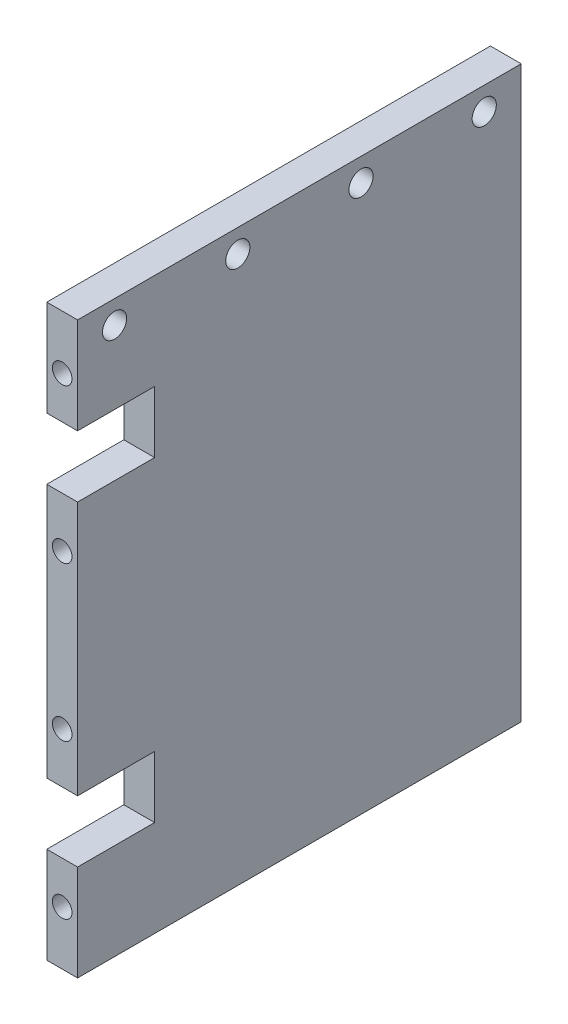
ISO-10303-21;
HEADER;
FILE_DESCRIPTION(('STEP AP214'),'2;1');
FILE_NAME('part.step','',(''),(''),'','','');
FILE_SCHEMA(('AUTOMOTIVE_DESIGN { 1 0 10303 214 1 1 1 1 }'));
ENDSEC;
DATA;
#1=APPLICATION_CONTEXT('core data for automotive mechanical design processes');
#2=APPLICATION_PROTOCOL_DEFINITION('international standard','automotive_design',2000,#1);
#3=PRODUCT_CONTEXT('',#1,'mechanical');
#4=PRODUCT('Part','Part','',(#3));
#5=PRODUCT_RELATED_PRODUCT_CATEGORY('part','',(#4));
#6=PRODUCT_DEFINITION_FORMATION('','',#4);
#7=PRODUCT_DEFINITION_CONTEXT('part definition',#1,'design');
#8=PRODUCT_DEFINITION('design','',#6,#7);
#9=PRODUCT_DEFINITION_SHAPE('','',#8);
#10=(LENGTH_UNIT() NAMED_UNIT(*) SI_UNIT(.MILLI.,.METRE.));
#11=(NAMED_UNIT(*) PLANE_ANGLE_UNIT() SI_UNIT($,.RADIAN.));
#12=(NAMED_UNIT(*) SI_UNIT($,.STERADIAN.) SOLID_ANGLE_UNIT());
#13=UNCERTAINTY_MEASURE_WITH_UNIT(LENGTH_MEASURE(1.E-05),#10,'distance_accuracy_value','');
#14=(GEOMETRIC_REPRESENTATION_CONTEXT(3) GLOBAL_UNCERTAINTY_ASSIGNED_CONTEXT((#13)) GLOBAL_UNIT_ASSIGNED_CONTEXT((#10,
#11,#12)) REPRESENTATION_CONTEXT('',''));
#15=CARTESIAN_POINT('',(0.,0.,0.));
#16=DIRECTION('',(0.,0.,1.));
#17=DIRECTION('',(1.,0.,0.));
#18=AXIS2_PLACEMENT_3D('',#15,#16,#17);
#19=CARTESIAN_POINT('',(0.,0.,45.72));
#20=DIRECTION('',(0.,0.,1.));
#21=DIRECTION('',(1.,0.,0.));
#22=AXIS2_PLACEMENT_3D('',#19,#20,#21);
#23=PLANE('',#22);
#24=CARTESIAN_POINT('',(-44.45,47.625,45.72));
#25=DIRECTION('',(0.,0.,1.));
#26=DIRECTION('',(1.,0.,0.));
#27=AXIS2_PLACEMENT_3D('',#24,#25,#26);
#28=CIRCLE('',#27,2.01929999999999);
#29=CARTESIAN_POINT('',(-42.4307,47.625,45.72));
#30=VERTEX_POINT('',#29);
#31=EDGE_CURVE('E149',#30,#30,#28,.T.);
#32=ORIENTED_EDGE('',*,*,#31,.F.);
#33=EDGE_LOOP('',(#32));
#34=FACE_BOUND('',#33,.T.);
#35=DIRECTION('',(1.,0.,0.));
#36=VECTOR('',#35,1.);
#37=CARTESIAN_POINT('',(-285.751,38.9255,45.72));
#38=LINE('',#37,#36);
#39=CARTESIAN_POINT('',(-47.625,38.9255,45.72));
#40=VERTEX_POINT('',#39);
#41=CARTESIAN_POINT('',(-41.275,38.9255,45.72));
#42=VERTEX_POINT('',#41);
#43=EDGE_CURVE('E189',#40,#42,#38,.T.);
#44=ORIENTED_EDGE('',*,*,#43,.T.);
#45=DIRECTION('',(0.,1.,0.));
#46=VECTOR('',#45,1.);
#47=CARTESIAN_POINT('',(-41.275,58.7375,45.72));
#48=LINE('',#47,#46);
#49=CARTESIAN_POINT('',(-41.275,58.7375,45.72));
#50=VERTEX_POINT('',#49);
#51=EDGE_CURVE('E229',#42,#50,#48,.T.);
#52=ORIENTED_EDGE('',*,*,#51,.T.);
#53=DIRECTION('',(-1.,0.,0.));
#54=VECTOR('',#53,1.);
#55=CARTESIAN_POINT('',(-47.625,58.7375,45.72));
#56=LINE('',#55,#54);
#57=CARTESIAN_POINT('',(-47.625,58.7375,45.72));
#58=VERTEX_POINT('',#57);
#59=EDGE_CURVE('E233',#50,#58,#56,.T.);
#60=ORIENTED_EDGE('',*,*,#59,.T.);
#61=DIRECTION('',(0.,-1.,0.));
#62=VECTOR('',#61,1.);
#63=CARTESIAN_POINT('',(-47.625,58.7375,45.72));
#64=LINE('',#63,#62);
#65=EDGE_CURVE('E222',#58,#40,#64,.T.);
#66=ORIENTED_EDGE('',*,*,#65,.T.);
#67=EDGE_LOOP('',(#44,#52,#60,#66));
#68=FACE_BOUND('',#67,.T.);
#69=ADVANCED_FACE('F39',(#34,#68),#23,.T.);
#70=CARTESIAN_POINT('',(-44.45,15.875,45.72));
#71=DIRECTION('',(0.,0.,1.));
#72=DIRECTION('',(1.,0.,0.));
#73=AXIS2_PLACEMENT_3D('',#70,#71,#72);
#74=CIRCLE('',#73,2.01929999999999);
#75=CARTESIAN_POINT('',(-42.4307,15.875,45.72));
#76=VERTEX_POINT('',#75);
#77=EDGE_CURVE('E148',#76,#76,#74,.T.);
#78=ORIENTED_EDGE('',*,*,#77,.F.);
#79=EDGE_LOOP('',(#78));
#80=FACE_BOUND('',#79,.T.);
#81=CARTESIAN_POINT('',(-44.45,-15.875,45.72));
#82=DIRECTION('',(0.,0.,1.));
#83=DIRECTION('',(1.,0.,0.));
#84=AXIS2_PLACEMENT_3D('',#81,#82,#83);
#85=CIRCLE('',#84,2.01929999999999);
#86=CARTESIAN_POINT('',(-42.4307,-15.875,45.72));
#87=VERTEX_POINT('',#86);
#88=EDGE_CURVE('E161',#87,#87,#85,.T.);
#89=ORIENTED_EDGE('',*,*,#88,.F.);
#90=EDGE_LOOP('',(#89));
#91=FACE_BOUND('',#90,.T.);
#92=DIRECTION('',(1.,0.,0.));
#93=VECTOR('',#92,1.);
#94=CARTESIAN_POINT('',(-285.751,26.2255,45.72));
#95=LINE('',#94,#93);
#96=CARTESIAN_POINT('',(-47.625,26.2255,45.72));
#97=VERTEX_POINT('',#96);
#98=CARTESIAN_POINT('',(-41.275,26.2255,45.72));
#99=VERTEX_POINT('',#98);
#100=EDGE_CURVE('E188',#97,#99,#95,.T.);
#101=ORIENTED_EDGE('',*,*,#100,.F.);
#102=CARTESIAN_POINT('',(-47.625,-26.2255,45.72));
#103=VERTEX_POINT('',#102);
#104=EDGE_CURVE('E226',#97,#103,#64,.T.);
#105=ORIENTED_EDGE('',*,*,#104,.T.);
#106=DIRECTION('',(1.,0.,0.));
#107=VECTOR('',#106,1.);
#108=CARTESIAN_POINT('',(-285.751,-26.2255,45.72));
#109=LINE('',#108,#107);
#110=CARTESIAN_POINT('',(-41.275,-26.2255,45.72));
#111=VERTEX_POINT('',#110);
#112=EDGE_CURVE('E213',#103,#111,#109,.T.);
#113=ORIENTED_EDGE('',*,*,#112,.T.);
#114=EDGE_CURVE('E234',#111,#99,#48,.T.);
#115=ORIENTED_EDGE('',*,*,#114,.T.);
#116=EDGE_LOOP('',(#101,#105,#113,#115));
#117=FACE_BOUND('',#116,.T.);
#118=ADVANCED_FACE('F278',(#80,#91,#117),#23,.T.);
#119=CARTESIAN_POINT('',(-47.625,58.7375,45.72));
#120=DIRECTION('',(1.,0.,0.));
#121=DIRECTION('',(0.,0.,-1.));
#122=AXIS2_PLACEMENT_3D('',#119,#120,#121);
#123=PLANE('',#122);
#124=CARTESIAN_POINT('',(-47.625,53.975,-38.1));
#125=DIRECTION('',(-1.,0.,0.));
#126=DIRECTION('',(0.,0.,1.));
#127=AXIS2_PLACEMENT_3D('',#124,#125,#126);
#128=CIRCLE('',#127,2.4892);
#129=CARTESIAN_POINT('',(-47.625,53.975,-35.6108));
#130=VERTEX_POINT('',#129);
#131=EDGE_CURVE('E496',#130,#130,#128,.T.);
#132=ORIENTED_EDGE('',*,*,#131,.F.);
#133=EDGE_LOOP('',(#132));
#134=FACE_BOUND('',#133,.T.);
#135=CARTESIAN_POINT('',(-47.625,53.975,-12.7));
#136=DIRECTION('',(-1.,0.,0.));
#137=DIRECTION('',(0.,0.,1.));
#138=AXIS2_PLACEMENT_3D('',#135,#136,#137);
#139=CIRCLE('',#138,2.4892);
#140=CARTESIAN_POINT('',(-47.625,53.975,-10.2108));
#141=VERTEX_POINT('',#140);
#142=EDGE_CURVE('E503',#141,#141,#139,.T.);
#143=ORIENTED_EDGE('',*,*,#142,.F.);
#144=EDGE_LOOP('',(#143));
#145=FACE_BOUND('',#144,.T.);
#146=CARTESIAN_POINT('',(-47.625,53.975,12.7));
#147=DIRECTION('',(-1.,0.,0.));
#148=DIRECTION('',(0.,0.,1.));
#149=AXIS2_PLACEMENT_3D('',#146,#147,#148);
#150=CIRCLE('',#149,2.4892);
#151=CARTESIAN_POINT('',(-47.625,53.975,15.1892));
#152=VERTEX_POINT('',#151);
#153=EDGE_CURVE('E509',#152,#152,#150,.T.);
#154=ORIENTED_EDGE('',*,*,#153,.F.);
#155=EDGE_LOOP('',(#154));
#156=FACE_BOUND('',#155,.T.);
#157=CARTESIAN_POINT('',(-47.625,53.975,38.1));
#158=DIRECTION('',(-1.,0.,0.));
#159=DIRECTION('',(0.,0.,1.));
#160=AXIS2_PLACEMENT_3D('',#157,#158,#159);
#161=CIRCLE('',#160,2.4892);
#162=CARTESIAN_POINT('',(-47.625,53.975,40.5892));
#163=VERTEX_POINT('',#162);
#164=EDGE_CURVE('E515',#163,#163,#161,.T.);
#165=ORIENTED_EDGE('',*,*,#164,.F.);
#166=EDGE_LOOP('',(#165));
#167=FACE_BOUND('',#166,.T.);
#168=DIRECTION('',(0.,-1.,0.));
#169=VECTOR('',#168,1.);
#170=CARTESIAN_POINT('',(-47.625,38.9255,29.845));
#171=LINE('',#170,#169);
#172=CARTESIAN_POINT('',(-47.625,38.9255,29.845));
#173=VERTEX_POINT('',#172);
#174=CARTESIAN_POINT('',(-47.625,26.2255,29.845));
#175=VERTEX_POINT('',#174);
#176=EDGE_CURVE('E174',#173,#175,#171,.T.);
#177=ORIENTED_EDGE('',*,*,#176,.F.);
#178=DIRECTION('',(0.,0.,-1.));
#179=VECTOR('',#178,1.);
#180=CARTESIAN_POINT('',(-47.625,38.9255,45.72));
#181=LINE('',#180,#179);
#182=EDGE_CURVE('E177',#40,#173,#181,.T.);
#183=ORIENTED_EDGE('',*,*,#182,.F.);
#184=ORIENTED_EDGE('',*,*,#65,.F.);
#185=DIRECTION('',(0.,0.,-1.));
#186=VECTOR('',#185,1.);
#187=CARTESIAN_POINT('',(-47.625,58.7375,45.72));
#188=LINE('',#187,#186);
#189=CARTESIAN_POINT('',(-47.625,58.7375,-45.72));
#190=VERTEX_POINT('',#189);
#191=EDGE_CURVE('E236',#58,#190,#188,.T.);
#192=ORIENTED_EDGE('',*,*,#191,.T.);
#193=DIRECTION('',(0.,-1.,0.));
#194=VECTOR('',#193,1.);
#195=CARTESIAN_POINT('',(-47.625,58.7375,-45.72));
#196=LINE('',#195,#194);
#197=CARTESIAN_POINT('',(-47.625,-58.7375,-45.72));
#198=VERTEX_POINT('',#197);
#199=EDGE_CURVE('E198',#190,#198,#196,.T.);
#200=ORIENTED_EDGE('',*,*,#199,.T.);
#201=DIRECTION('',(0.,0.,-1.));
#202=VECTOR('',#201,1.);
#203=CARTESIAN_POINT('',(-47.625,-58.7375,45.72));
#204=LINE('',#203,#202);
#205=CARTESIAN_POINT('',(-47.625,-58.7375,45.72));
#206=VERTEX_POINT('',#205);
#207=EDGE_CURVE('E11',#206,#198,#204,.T.);
#208=ORIENTED_EDGE('',*,*,#207,.F.);
#209=CARTESIAN_POINT('',(-47.625,-38.9255,45.72));
#210=VERTEX_POINT('',#209);
#211=EDGE_CURVE('E227',#210,#206,#64,.T.);
#212=ORIENTED_EDGE('',*,*,#211,.F.);
#213=DIRECTION('',(0.,0.,1.));
#214=VECTOR('',#213,1.);
#215=CARTESIAN_POINT('',(-47.625,-38.9255,45.72));
#216=LINE('',#215,#214);
#217=CARTESIAN_POINT('',(-47.625,-38.9255,29.845));
#218=VERTEX_POINT('',#217);
#219=EDGE_CURVE('E54',#218,#210,#216,.T.);
#220=ORIENTED_EDGE('',*,*,#219,.F.);
#221=DIRECTION('',(0.,-1.,0.));
#222=VECTOR('',#221,1.);
#223=CARTESIAN_POINT('',(-47.625,-38.9255,29.845));
#224=LINE('',#223,#222);
#225=CARTESIAN_POINT('',(-47.625,-26.2255,29.845));
#226=VERTEX_POINT('',#225);
#227=EDGE_CURVE('E173',#226,#218,#224,.T.);
#228=ORIENTED_EDGE('',*,*,#227,.F.);
#229=DIRECTION('',(0.,0.,-1.));
#230=VECTOR('',#229,1.);
#231=CARTESIAN_POINT('',(-47.625,-26.2255,45.72));
#232=LINE('',#231,#230);
#233=EDGE_CURVE('E201',#103,#226,#232,.T.);
#234=ORIENTED_EDGE('',*,*,#233,.F.);
#235=ORIENTED_EDGE('',*,*,#104,.F.);
#236=DIRECTION('',(0.,0.,1.));
#237=VECTOR('',#236,1.);
#238=CARTESIAN_POINT('',(-47.625,26.2255,45.72));
#239=LINE('',#238,#237);
#240=EDGE_CURVE('E62',#175,#97,#239,.T.);
#241=ORIENTED_EDGE('',*,*,#240,.F.);
#242=EDGE_LOOP('',(#177,#183,#184,#192,#200,#208,#212,#220,#228,#234,#235,#241));
#243=FACE_BOUND('',#242,.T.);
#244=ADVANCED_FACE('F41',(#134,#145,#156,#167,#243),#123,.F.);
#245=CARTESIAN_POINT('',(-47.625,-58.7375,45.72));
#246=DIRECTION('',(0.,1.,0.));
#247=DIRECTION('',(0.,0.,1.));
#248=AXIS2_PLACEMENT_3D('',#245,#246,#247);
#249=PLANE('',#248);
#250=DIRECTION('',(1.,0.,0.));
#251=VECTOR('',#250,1.);
#252=CARTESIAN_POINT('',(-47.625,-58.7375,-45.72));
#253=LINE('',#252,#251);
#254=CARTESIAN_POINT('',(-41.275,-58.7375,-45.72));
#255=VERTEX_POINT('',#254);
#256=EDGE_CURVE('E239',#198,#255,#253,.T.);
#257=ORIENTED_EDGE('',*,*,#256,.T.);
#258=DIRECTION('',(0.,0.,-1.));
#259=VECTOR('',#258,1.);
#260=CARTESIAN_POINT('',(-41.275,-58.7375,45.72));
#261=LINE('',#260,#259);
#262=CARTESIAN_POINT('',(-41.275,-58.7375,45.72));
#263=VERTEX_POINT('',#262);
#264=EDGE_CURVE('E47',#263,#255,#261,.T.);
#265=ORIENTED_EDGE('',*,*,#264,.F.);
#266=DIRECTION('',(1.,0.,0.));
#267=VECTOR('',#266,1.);
#268=CARTESIAN_POINT('',(-47.625,-58.7375,45.72));
#269=LINE('',#268,#267);
#270=EDGE_CURVE('E225',#206,#263,#269,.T.);
#271=ORIENTED_EDGE('',*,*,#270,.F.);
#272=ORIENTED_EDGE('',*,*,#207,.T.);
#273=EDGE_LOOP('',(#257,#265,#271,#272));
#274=FACE_BOUND('',#273,.T.);
#275=ADVANCED_FACE('F293',(#274),#249,.F.);
#276=CARTESIAN_POINT('',(-41.275,58.7375,45.72));
#277=DIRECTION('',(-1.,0.,0.));
#278=DIRECTION('',(0.,0.,1.));
#279=AXIS2_PLACEMENT_3D('',#276,#277,#278);
#280=PLANE('',#279);
#281=CARTESIAN_POINT('',(-41.275,53.975,-38.1));
#282=DIRECTION('',(-1.,0.,0.));
#283=DIRECTION('',(0.,0.,1.));
#284=AXIS2_PLACEMENT_3D('',#281,#282,#283);
#285=CIRCLE('',#284,2.4892);
#286=CARTESIAN_POINT('',(-41.275,53.975,-35.6108));
#287=VERTEX_POINT('',#286);
#288=EDGE_CURVE('E155',#287,#287,#285,.F.);
#289=ORIENTED_EDGE('',*,*,#288,.F.);
#290=EDGE_LOOP('',(#289));
#291=FACE_BOUND('',#290,.T.);
#292=CARTESIAN_POINT('',(-41.275,53.975,-12.7));
#293=DIRECTION('',(-1.,0.,0.));
#294=DIRECTION('',(0.,0.,1.));
#295=AXIS2_PLACEMENT_3D('',#292,#293,#294);
#296=CIRCLE('',#295,2.4892);
#297=CARTESIAN_POINT('',(-41.275,53.975,-10.2108));
#298=VERTEX_POINT('',#297);
#299=EDGE_CURVE('E500',#298,#298,#296,.F.);
#300=ORIENTED_EDGE('',*,*,#299,.F.);
#301=EDGE_LOOP('',(#300));
#302=FACE_BOUND('',#301,.T.);
#303=CARTESIAN_POINT('',(-41.275,53.975,12.7));
#304=DIRECTION('',(-1.,0.,0.));
#305=DIRECTION('',(0.,0.,1.));
#306=AXIS2_PLACEMENT_3D('',#303,#304,#305);
#307=CIRCLE('',#306,2.4892);
#308=CARTESIAN_POINT('',(-41.275,53.975,15.1892));
#309=VERTEX_POINT('',#308);
#310=EDGE_CURVE('E506',#309,#309,#307,.F.);
#311=ORIENTED_EDGE('',*,*,#310,.F.);
#312=EDGE_LOOP('',(#311));
#313=FACE_BOUND('',#312,.T.);
#314=CARTESIAN_POINT('',(-41.275,53.975,38.1));
#315=DIRECTION('',(-1.,0.,0.));
#316=DIRECTION('',(0.,0.,1.));
#317=AXIS2_PLACEMENT_3D('',#314,#315,#316);
#318=CIRCLE('',#317,2.4892);
#319=CARTESIAN_POINT('',(-41.275,53.975,40.5892));
#320=VERTEX_POINT('',#319);
#321=EDGE_CURVE('E512',#320,#320,#318,.F.);
#322=ORIENTED_EDGE('',*,*,#321,.F.);
#323=EDGE_LOOP('',(#322));
#324=FACE_BOUND('',#323,.T.);
#325=ORIENTED_EDGE('',*,*,#51,.F.);
#326=DIRECTION('',(0.,0.,1.));
#327=VECTOR('',#326,1.);
#328=CARTESIAN_POINT('',(-41.275,38.9255,45.72));
#329=LINE('',#328,#327);
#330=CARTESIAN_POINT('',(-41.275,38.9255,29.845));
#331=VERTEX_POINT('',#330);
#332=EDGE_CURVE('E186',#331,#42,#329,.T.);
#333=ORIENTED_EDGE('',*,*,#332,.F.);
#334=DIRECTION('',(0.,1.,0.));
#335=VECTOR('',#334,1.);
#336=CARTESIAN_POINT('',(-41.275,38.9255,29.845));
#337=LINE('',#336,#335);
#338=CARTESIAN_POINT('',(-41.275,26.2255,29.845));
#339=VERTEX_POINT('',#338);
#340=EDGE_CURVE('E183',#339,#331,#337,.T.);
#341=ORIENTED_EDGE('',*,*,#340,.F.);
#342=DIRECTION('',(0.,0.,-1.));
#343=VECTOR('',#342,1.);
#344=CARTESIAN_POINT('',(-41.275,26.2255,45.72));
#345=LINE('',#344,#343);
#346=EDGE_CURVE('E180',#99,#339,#345,.T.);
#347=ORIENTED_EDGE('',*,*,#346,.F.);
#348=ORIENTED_EDGE('',*,*,#114,.F.);
#349=DIRECTION('',(0.,0.,1.));
#350=VECTOR('',#349,1.);
#351=CARTESIAN_POINT('',(-41.275,-26.2255,45.72));
#352=LINE('',#351,#350);
#353=CARTESIAN_POINT('',(-41.275,-26.2255,29.845));
#354=VERTEX_POINT('',#353);
#355=EDGE_CURVE('E210',#354,#111,#352,.T.);
#356=ORIENTED_EDGE('',*,*,#355,.F.);
#357=DIRECTION('',(0.,1.,0.));
#358=VECTOR('',#357,1.);
#359=CARTESIAN_POINT('',(-41.275,-38.9255,29.845));
#360=LINE('',#359,#358);
#361=CARTESIAN_POINT('',(-41.275,-38.9255,29.845));
#362=VERTEX_POINT('',#361);
#363=EDGE_CURVE('E207',#362,#354,#360,.T.);
#364=ORIENTED_EDGE('',*,*,#363,.F.);
#365=DIRECTION('',(0.,0.,-1.));
#366=VECTOR('',#365,1.);
#367=CARTESIAN_POINT('',(-41.275,-38.9255,45.72));
#368=LINE('',#367,#366);
#369=CARTESIAN_POINT('',(-41.275,-38.9255,45.72));
#370=VERTEX_POINT('',#369);
#371=EDGE_CURVE('E204',#370,#362,#368,.T.);
#372=ORIENTED_EDGE('',*,*,#371,.F.);
#373=EDGE_CURVE('E230',#263,#370,#48,.T.);
#374=ORIENTED_EDGE('',*,*,#373,.F.);
#375=ORIENTED_EDGE('',*,*,#264,.T.);
#376=DIRECTION('',(0.,1.,0.));
#377=VECTOR('',#376,1.);
#378=CARTESIAN_POINT('',(-41.275,58.7375,-45.72));
#379=LINE('',#378,#377);
#380=CARTESIAN_POINT('',(-41.275,58.7375,-45.72));
#381=VERTEX_POINT('',#380);
#382=EDGE_CURVE('E241',#255,#381,#379,.T.);
#383=ORIENTED_EDGE('',*,*,#382,.T.);
#384=DIRECTION('',(0.,0.,-1.));
#385=VECTOR('',#384,1.);
#386=CARTESIAN_POINT('',(-41.275,58.7375,45.72));
#387=LINE('',#386,#385);
#388=EDGE_CURVE('E247',#50,#381,#387,.T.);
#389=ORIENTED_EDGE('',*,*,#388,.F.);
#390=EDGE_LOOP('',(#325,#333,#341,#347,#348,#356,#364,#372,#374,#375,#383,#389));
#391=FACE_BOUND('',#390,.T.);
#392=ADVANCED_FACE('F255',(#291,#302,#313,#324,#391),#280,.F.);
#393=CARTESIAN_POINT('',(-47.625,58.7375,45.72));
#394=DIRECTION('',(0.,-1.,0.));
#395=DIRECTION('',(0.,0.,-1.));
#396=AXIS2_PLACEMENT_3D('',#393,#394,#395);
#397=PLANE('',#396);
#398=DIRECTION('',(-1.,0.,0.));
#399=VECTOR('',#398,1.);
#400=CARTESIAN_POINT('',(-47.625,58.7375,-45.72));
#401=LINE('',#400,#399);
#402=EDGE_CURVE('E243',#381,#190,#401,.T.);
#403=ORIENTED_EDGE('',*,*,#402,.T.);
#404=ORIENTED_EDGE('',*,*,#191,.F.);
#405=ORIENTED_EDGE('',*,*,#59,.F.);
#406=ORIENTED_EDGE('',*,*,#388,.T.);
#407=EDGE_LOOP('',(#403,#404,#405,#406));
#408=FACE_BOUND('',#407,.T.);
#409=ADVANCED_FACE('F266',(#408),#397,.F.);
#410=CARTESIAN_POINT('',(-44.45,-47.625,45.72));
#411=DIRECTION('',(0.,0.,1.));
#412=DIRECTION('',(1.,0.,0.));
#413=AXIS2_PLACEMENT_3D('',#410,#411,#412);
#414=CIRCLE('',#413,2.01929999999999);
#415=CARTESIAN_POINT('',(-42.4307,-47.625,45.72));
#416=VERTEX_POINT('',#415);
#417=EDGE_CURVE('E167',#416,#416,#414,.T.);
#418=ORIENTED_EDGE('',*,*,#417,.F.);
#419=EDGE_LOOP('',(#418));
#420=FACE_BOUND('',#419,.T.);
#421=DIRECTION('',(1.,0.,0.));
#422=VECTOR('',#421,1.);
#423=CARTESIAN_POINT('',(-285.751,-38.9255,45.72));
#424=LINE('',#423,#422);
#425=EDGE_CURVE('E212',#210,#370,#424,.T.);
#426=ORIENTED_EDGE('',*,*,#425,.F.);
#427=ORIENTED_EDGE('',*,*,#211,.T.);
#428=ORIENTED_EDGE('',*,*,#270,.T.);
#429=ORIENTED_EDGE('',*,*,#373,.T.);
#430=EDGE_LOOP('',(#426,#427,#428,#429));
#431=FACE_BOUND('',#430,.T.);
#432=ADVANCED_FACE('F292',(#420,#431),#23,.T.);
#433=CARTESIAN_POINT('',(0.,0.,-45.72));
#434=DIRECTION('',(0.,0.,1.));
#435=DIRECTION('',(1.,0.,0.));
#436=AXIS2_PLACEMENT_3D('',#433,#434,#435);
#437=PLANE('',#436);
#438=ORIENTED_EDGE('',*,*,#199,.F.);
#439=ORIENTED_EDGE('',*,*,#402,.F.);
#440=ORIENTED_EDGE('',*,*,#382,.F.);
#441=ORIENTED_EDGE('',*,*,#256,.F.);
#442=EDGE_LOOP('',(#438,#439,#440,#441));
#443=FACE_BOUND('',#442,.T.);
#444=ADVANCED_FACE('F263',(#443),#437,.F.);
#445=CARTESIAN_POINT('',(-285.751,-26.2255,45.72));
#446=DIRECTION('',(0.,1.,0.));
#447=DIRECTION('',(0.,0.,1.));
#448=AXIS2_PLACEMENT_3D('',#445,#446,#447);
#449=PLANE('',#448);
#450=ORIENTED_EDGE('',*,*,#233,.T.);
#451=DIRECTION('',(1.,0.,0.));
#452=VECTOR('',#451,1.);
#453=CARTESIAN_POINT('',(-285.751,-26.2255,29.845));
#454=LINE('',#453,#452);
#455=EDGE_CURVE('E216',#226,#354,#454,.T.);
#456=ORIENTED_EDGE('',*,*,#455,.T.);
#457=ORIENTED_EDGE('',*,*,#355,.T.);
#458=ORIENTED_EDGE('',*,*,#112,.F.);
#459=EDGE_LOOP('',(#450,#456,#457,#458));
#460=FACE_BOUND('',#459,.T.);
#461=ADVANCED_FACE('F318',(#460),#449,.F.);
#462=CARTESIAN_POINT('',(-285.751,-38.9255,29.845));
#463=DIRECTION('',(0.,0.,-1.));
#464=DIRECTION('',(-1.,0.,0.));
#465=AXIS2_PLACEMENT_3D('',#462,#463,#464);
#466=PLANE('',#465);
#467=ORIENTED_EDGE('',*,*,#227,.T.);
#468=DIRECTION('',(1.,0.,0.));
#469=VECTOR('',#468,1.);
#470=CARTESIAN_POINT('',(-285.751,-38.9255,29.845));
#471=LINE('',#470,#469);
#472=EDGE_CURVE('E218',#218,#362,#471,.T.);
#473=ORIENTED_EDGE('',*,*,#472,.T.);
#474=ORIENTED_EDGE('',*,*,#363,.T.);
#475=ORIENTED_EDGE('',*,*,#455,.F.);
#476=EDGE_LOOP('',(#467,#473,#474,#475));
#477=FACE_BOUND('',#476,.T.);
#478=ADVANCED_FACE('F351',(#477),#466,.F.);
#479=CARTESIAN_POINT('',(-285.751,-38.9255,45.72));
#480=DIRECTION('',(0.,-1.,0.));
#481=DIRECTION('',(0.,0.,-1.));
#482=AXIS2_PLACEMENT_3D('',#479,#480,#481);
#483=PLANE('',#482);
#484=ORIENTED_EDGE('',*,*,#219,.T.);
#485=ORIENTED_EDGE('',*,*,#425,.T.);
#486=ORIENTED_EDGE('',*,*,#371,.T.);
#487=ORIENTED_EDGE('',*,*,#472,.F.);
#488=EDGE_LOOP('',(#484,#485,#486,#487));
#489=FACE_BOUND('',#488,.T.);
#490=ADVANCED_FACE('F343',(#489),#483,.F.);
#491=CARTESIAN_POINT('',(-285.751,38.9255,45.72));
#492=DIRECTION('',(0.,1.,0.));
#493=DIRECTION('',(0.,0.,1.));
#494=AXIS2_PLACEMENT_3D('',#491,#492,#493);
#495=PLANE('',#494);
#496=ORIENTED_EDGE('',*,*,#182,.T.);
#497=DIRECTION('',(1.,0.,0.));
#498=VECTOR('',#497,1.);
#499=CARTESIAN_POINT('',(-285.751,38.9255,29.845));
#500=LINE('',#499,#498);
#501=EDGE_CURVE('E192',#173,#331,#500,.T.);
#502=ORIENTED_EDGE('',*,*,#501,.T.);
#503=ORIENTED_EDGE('',*,*,#332,.T.);
#504=ORIENTED_EDGE('',*,*,#43,.F.);
#505=EDGE_LOOP('',(#496,#502,#503,#504));
#506=FACE_BOUND('',#505,.T.);
#507=ADVANCED_FACE('F340',(#506),#495,.F.);
#508=CARTESIAN_POINT('',(-285.751,38.9255,29.845));
#509=DIRECTION('',(0.,0.,-1.));
#510=DIRECTION('',(-1.,0.,0.));
#511=AXIS2_PLACEMENT_3D('',#508,#509,#510);
#512=PLANE('',#511);
#513=ORIENTED_EDGE('',*,*,#176,.T.);
#514=DIRECTION('',(1.,0.,0.));
#515=VECTOR('',#514,1.);
#516=CARTESIAN_POINT('',(-285.751,26.2255,29.845));
#517=LINE('',#516,#515);
#518=EDGE_CURVE('E194',#175,#339,#517,.T.);
#519=ORIENTED_EDGE('',*,*,#518,.T.);
#520=ORIENTED_EDGE('',*,*,#340,.T.);
#521=ORIENTED_EDGE('',*,*,#501,.F.);
#522=EDGE_LOOP('',(#513,#519,#520,#521));
#523=FACE_BOUND('',#522,.T.);
#524=ADVANCED_FACE('F287',(#523),#512,.F.);
#525=CARTESIAN_POINT('',(-285.751,26.2255,45.72));
#526=DIRECTION('',(0.,-1.,0.));
#527=DIRECTION('',(0.,0.,-1.));
#528=AXIS2_PLACEMENT_3D('',#525,#526,#527);
#529=PLANE('',#528);
#530=ORIENTED_EDGE('',*,*,#240,.T.);
#531=ORIENTED_EDGE('',*,*,#100,.T.);
#532=ORIENTED_EDGE('',*,*,#346,.T.);
#533=ORIENTED_EDGE('',*,*,#518,.F.);
#534=EDGE_LOOP('',(#530,#531,#532,#533));
#535=FACE_BOUND('',#534,.T.);
#536=ADVANCED_FACE('F285',(#535),#529,.F.);
#537=CARTESIAN_POINT('',(-44.45,-47.625,33.02));
#538=DIRECTION('',(0.,0.,1.));
#539=DIRECTION('',(1.,0.,0.));
#540=AXIS2_PLACEMENT_3D('',#537,#538,#539);
#541=CONICAL_SURFACE('',#540,2.01929999999999,1.02974425867665);
#542=CARTESIAN_POINT('',(-44.45,-47.625,31.8066821519976));
#543=VERTEX_POINT('',#542);
#544=VERTEX_LOOP('',#543);
#545=FACE_BOUND('',#544,.T.);
#546=CARTESIAN_POINT('',(-44.45,-47.625,33.02));
#547=DIRECTION('',(0.,0.,1.));
#548=DIRECTION('',(1.,0.,0.));
#549=AXIS2_PLACEMENT_3D('',#546,#547,#548);
#550=CIRCLE('',#549,2.01929999999999);
#551=CARTESIAN_POINT('',(-42.4307,-47.625,33.02));
#552=VERTEX_POINT('',#551);
#553=EDGE_CURVE('E170',#552,#552,#550,.T.);
#554=ORIENTED_EDGE('',*,*,#553,.T.);
#555=EDGE_LOOP('',(#554));
#556=FACE_BOUND('',#555,.T.);
#557=ADVANCED_FACE('F325',(#545,#556),#541,.F.);
#558=CARTESIAN_POINT('',(-44.45,-47.625,45.72));
#559=DIRECTION('',(0.,0.,1.));
#560=DIRECTION('',(1.,0.,0.));
#561=AXIS2_PLACEMENT_3D('',#558,#559,#560);
#562=CYLINDRICAL_SURFACE('',#561,2.01929999999999);
#563=ORIENTED_EDGE('',*,*,#553,.F.);
#564=EDGE_LOOP('',(#563));
#565=FACE_BOUND('',#564,.T.);
#566=ORIENTED_EDGE('',*,*,#417,.T.);
#567=EDGE_LOOP('',(#566));
#568=FACE_BOUND('',#567,.T.);
#569=ADVANCED_FACE('F322',(#565,#568),#562,.F.);
#570=CARTESIAN_POINT('',(-44.45,-15.875,33.02));
#571=DIRECTION('',(0.,0.,1.));
#572=DIRECTION('',(1.,0.,0.));
#573=AXIS2_PLACEMENT_3D('',#570,#571,#572);
#574=CONICAL_SURFACE('',#573,2.01929999999999,1.02974425867665);
#575=CARTESIAN_POINT('',(-44.45,-15.875,31.8066821519976));
#576=VERTEX_POINT('',#575);
#577=VERTEX_LOOP('',#576);
#578=FACE_BOUND('',#577,.T.);
#579=CARTESIAN_POINT('',(-44.45,-15.875,33.02));
#580=DIRECTION('',(0.,0.,1.));
#581=DIRECTION('',(1.,0.,0.));
#582=AXIS2_PLACEMENT_3D('',#579,#580,#581);
#583=CIRCLE('',#582,2.01929999999999);
#584=CARTESIAN_POINT('',(-42.4307,-15.875,33.02));
#585=VERTEX_POINT('',#584);
#586=EDGE_CURVE('E164',#585,#585,#583,.T.);
#587=ORIENTED_EDGE('',*,*,#586,.T.);
#588=EDGE_LOOP('',(#587));
#589=FACE_BOUND('',#588,.T.);
#590=ADVANCED_FACE('F324',(#578,#589),#574,.F.);
#591=CARTESIAN_POINT('',(-44.45,-15.875,45.72));
#592=DIRECTION('',(0.,0.,1.));
#593=DIRECTION('',(1.,0.,0.));
#594=AXIS2_PLACEMENT_3D('',#591,#592,#593);
#595=CYLINDRICAL_SURFACE('',#594,2.01929999999999);
#596=ORIENTED_EDGE('',*,*,#586,.F.);
#597=EDGE_LOOP('',(#596));
#598=FACE_BOUND('',#597,.T.);
#599=ORIENTED_EDGE('',*,*,#88,.T.);
#600=EDGE_LOOP('',(#599));
#601=FACE_BOUND('',#600,.T.);
#602=ADVANCED_FACE('F332',(#598,#601),#595,.F.);
#603=CARTESIAN_POINT('',(-44.45,15.875,33.02));
#604=DIRECTION('',(0.,0.,1.));
#605=DIRECTION('',(1.,0.,0.));
#606=AXIS2_PLACEMENT_3D('',#603,#604,#605);
#607=CONICAL_SURFACE('',#606,2.01929999999999,1.02974425867665);
#608=CARTESIAN_POINT('',(-44.45,15.875,31.8066821519976));
#609=VERTEX_POINT('',#608);
#610=VERTEX_LOOP('',#609);
#611=FACE_BOUND('',#610,.T.);
#612=CARTESIAN_POINT('',(-44.45,15.875,33.02));
#613=DIRECTION('',(0.,0.,1.));
#614=DIRECTION('',(1.,0.,0.));
#615=AXIS2_PLACEMENT_3D('',#612,#613,#614);
#616=CIRCLE('',#615,2.01929999999999);
#617=CARTESIAN_POINT('',(-42.4307,15.875,33.02));
#618=VERTEX_POINT('',#617);
#619=EDGE_CURVE('E152',#618,#618,#616,.T.);
#620=ORIENTED_EDGE('',*,*,#619,.T.);
#621=EDGE_LOOP('',(#620));
#622=FACE_BOUND('',#621,.T.);
#623=ADVANCED_FACE('F406',(#611,#622),#607,.F.);
#624=CARTESIAN_POINT('',(-44.45,15.875,45.72));
#625=DIRECTION('',(0.,0.,1.));
#626=DIRECTION('',(1.,0.,0.));
#627=AXIS2_PLACEMENT_3D('',#624,#625,#626);
#628=CYLINDRICAL_SURFACE('',#627,2.01929999999999);
#629=ORIENTED_EDGE('',*,*,#619,.F.);
#630=EDGE_LOOP('',(#629));
#631=FACE_BOUND('',#630,.T.);
#632=ORIENTED_EDGE('',*,*,#77,.T.);
#633=EDGE_LOOP('',(#632));
#634=FACE_BOUND('',#633,.T.);
#635=ADVANCED_FACE('F142',(#631,#634),#628,.F.);
#636=CARTESIAN_POINT('',(-44.45,47.625,33.02));
#637=DIRECTION('',(0.,0.,1.));
#638=DIRECTION('',(1.,0.,0.));
#639=AXIS2_PLACEMENT_3D('',#636,#637,#638);
#640=CONICAL_SURFACE('',#639,2.01929999999999,1.02974425867665);
#641=CARTESIAN_POINT('',(-44.45,47.625,31.8066821519976));
#642=VERTEX_POINT('',#641);
#643=VERTEX_LOOP('',#642);
#644=FACE_BOUND('',#643,.T.);
#645=CARTESIAN_POINT('',(-44.45,47.625,33.02));
#646=DIRECTION('',(0.,0.,1.));
#647=DIRECTION('',(1.,0.,0.));
#648=AXIS2_PLACEMENT_3D('',#645,#646,#647);
#649=CIRCLE('',#648,2.01929999999999);
#650=CARTESIAN_POINT('',(-42.4307,47.625,33.02));
#651=VERTEX_POINT('',#650);
#652=EDGE_CURVE('E146',#651,#651,#649,.T.);
#653=ORIENTED_EDGE('',*,*,#652,.T.);
#654=EDGE_LOOP('',(#653));
#655=FACE_BOUND('',#654,.T.);
#656=ADVANCED_FACE('F138',(#644,#655),#640,.F.);
#657=CARTESIAN_POINT('',(-44.45,47.625,45.72));
#658=DIRECTION('',(0.,0.,1.));
#659=DIRECTION('',(1.,0.,0.));
#660=AXIS2_PLACEMENT_3D('',#657,#658,#659);
#661=CYLINDRICAL_SURFACE('',#660,2.01929999999999);
#662=ORIENTED_EDGE('',*,*,#652,.F.);
#663=EDGE_LOOP('',(#662));
#664=FACE_BOUND('',#663,.T.);
#665=ORIENTED_EDGE('',*,*,#31,.T.);
#666=EDGE_LOOP('',(#665));
#667=FACE_BOUND('',#666,.T.);
#668=ADVANCED_FACE('F141',(#664,#667),#661,.F.);
#669=CARTESIAN_POINT('',(285.751,53.975,38.1));
#670=DIRECTION('',(-1.,0.,0.));
#671=DIRECTION('',(0.,0.,1.));
#672=AXIS2_PLACEMENT_3D('',#669,#670,#671);
#673=CYLINDRICAL_SURFACE('',#672,2.4892);
#674=ORIENTED_EDGE('',*,*,#164,.T.);
#675=EDGE_LOOP('',(#674));
#676=FACE_BOUND('',#675,.T.);
#677=ORIENTED_EDGE('',*,*,#321,.T.);
#678=EDGE_LOOP('',(#677));
#679=FACE_BOUND('',#678,.T.);
#680=ADVANCED_FACE('F448',(#676,#679),#673,.F.);
#681=CARTESIAN_POINT('',(285.751,53.975,12.7));
#682=DIRECTION('',(-1.,0.,0.));
#683=DIRECTION('',(0.,0.,1.));
#684=AXIS2_PLACEMENT_3D('',#681,#682,#683);
#685=CYLINDRICAL_SURFACE('',#684,2.4892);
#686=ORIENTED_EDGE('',*,*,#153,.T.);
#687=EDGE_LOOP('',(#686));
#688=FACE_BOUND('',#687,.T.);
#689=ORIENTED_EDGE('',*,*,#310,.T.);
#690=EDGE_LOOP('',(#689));
#691=FACE_BOUND('',#690,.T.);
#692=ADVANCED_FACE('F460',(#688,#691),#685,.F.);
#693=CARTESIAN_POINT('',(285.751,53.975,-12.7));
#694=DIRECTION('',(-1.,0.,0.));
#695=DIRECTION('',(0.,0.,1.));
#696=AXIS2_PLACEMENT_3D('',#693,#694,#695);
#697=CYLINDRICAL_SURFACE('',#696,2.4892);
#698=ORIENTED_EDGE('',*,*,#142,.T.);
#699=EDGE_LOOP('',(#698));
#700=FACE_BOUND('',#699,.T.);
#701=ORIENTED_EDGE('',*,*,#299,.T.);
#702=EDGE_LOOP('',(#701));
#703=FACE_BOUND('',#702,.T.);
#704=ADVANCED_FACE('F470',(#700,#703),#697,.F.);
#705=CARTESIAN_POINT('',(285.751,53.975,-38.1));
#706=DIRECTION('',(-1.,0.,0.));
#707=DIRECTION('',(0.,0.,1.));
#708=AXIS2_PLACEMENT_3D('',#705,#706,#707);
#709=CYLINDRICAL_SURFACE('',#708,2.4892);
#710=ORIENTED_EDGE('',*,*,#131,.T.);
#711=EDGE_LOOP('',(#710));
#712=FACE_BOUND('',#711,.T.);
#713=ORIENTED_EDGE('',*,*,#288,.T.);
#714=EDGE_LOOP('',(#713));
#715=FACE_BOUND('',#714,.T.);
#716=ADVANCED_FACE('F480',(#712,#715),#709,.F.);
#717=CLOSED_SHELL('',(#69,#118,#244,#275,#392,#409,#432,#444,#461,#478,#490,#507,#524,#536,#557,
#569,#590,#602,#623,#635,#656,#668,#680,#692,#704,#716));
#718=MANIFOLD_SOLID_BREP('B2',#717);
#719=ADVANCED_BREP_SHAPE_REPRESENTATION('',(#18,#718),#14);
#720=SHAPE_DEFINITION_REPRESENTATION(#9,#719);
ENDSEC;
END-ISO-10303-21;
